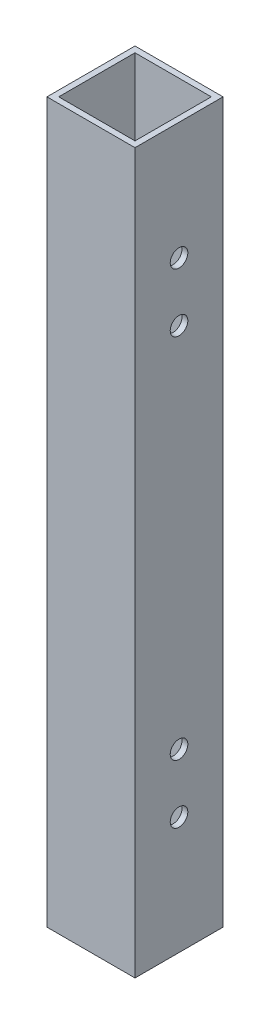
ISO-10303-21;
HEADER;
FILE_DESCRIPTION(('STEP AP214'),'2;1');
FILE_NAME('part.step','',(''),(''),'','','');
FILE_SCHEMA(('AUTOMOTIVE_DESIGN { 1 0 10303 214 1 1 1 1 }'));
ENDSEC;
DATA;
#1=APPLICATION_CONTEXT('core data for automotive mechanical design processes');
#2=APPLICATION_PROTOCOL_DEFINITION('international standard','automotive_design',2000,#1);
#3=PRODUCT_CONTEXT('',#1,'mechanical');
#4=PRODUCT('Part','Part','',(#3));
#5=PRODUCT_RELATED_PRODUCT_CATEGORY('part','',(#4));
#6=PRODUCT_DEFINITION_FORMATION('','',#4);
#7=PRODUCT_DEFINITION_CONTEXT('part definition',#1,'design');
#8=PRODUCT_DEFINITION('design','',#6,#7);
#9=PRODUCT_DEFINITION_SHAPE('','',#8);
#10=(LENGTH_UNIT() NAMED_UNIT(*) SI_UNIT(.MILLI.,.METRE.));
#11=(NAMED_UNIT(*) PLANE_ANGLE_UNIT() SI_UNIT($,.RADIAN.));
#12=(NAMED_UNIT(*) SI_UNIT($,.STERADIAN.) SOLID_ANGLE_UNIT());
#13=UNCERTAINTY_MEASURE_WITH_UNIT(LENGTH_MEASURE(1.E-05),#10,'distance_accuracy_value','');
#14=(GEOMETRIC_REPRESENTATION_CONTEXT(3) GLOBAL_UNCERTAINTY_ASSIGNED_CONTEXT((#13)) GLOBAL_UNIT_ASSIGNED_CONTEXT((#10,
#11,#12)) REPRESENTATION_CONTEXT('',''));
#15=CARTESIAN_POINT('',(0.,0.,0.));
#16=DIRECTION('',(0.,0.,1.));
#17=DIRECTION('',(1.,0.,0.));
#18=AXIS2_PLACEMENT_3D('',#15,#16,#17);
#19=CARTESIAN_POINT('',(15.,245.,15.));
#20=DIRECTION('',(0.,0.,-1.));
#21=DIRECTION('',(-1.,0.,0.));
#22=AXIS2_PLACEMENT_3D('',#19,#20,#21);
#23=PLANE('',#22);
#24=DIRECTION('',(1.,0.,0.));
#25=VECTOR('',#24,1.);
#26=CARTESIAN_POINT('',(15.,0.,15.));
#27=LINE('',#26,#25);
#28=CARTESIAN_POINT('',(-15.,0.,15.));
#29=VERTEX_POINT('',#28);
#30=CARTESIAN_POINT('',(15.,0.,15.));
#31=VERTEX_POINT('',#30);
#32=EDGE_CURVE('E134',#29,#31,#27,.T.);
#33=ORIENTED_EDGE('',*,*,#32,.T.);
#34=DIRECTION('',(0.,-1.,0.));
#35=VECTOR('',#34,1.);
#36=CARTESIAN_POINT('',(15.,245.,15.));
#37=LINE('',#36,#35);
#38=CARTESIAN_POINT('',(15.,245.,15.));
#39=VERTEX_POINT('',#38);
#40=EDGE_CURVE('E40',#39,#31,#37,.T.);
#41=ORIENTED_EDGE('',*,*,#40,.F.);
#42=DIRECTION('',(1.,0.,0.));
#43=VECTOR('',#42,1.);
#44=CARTESIAN_POINT('',(15.,245.,15.));
#45=LINE('',#44,#43);
#46=CARTESIAN_POINT('',(-15.,245.,15.));
#47=VERTEX_POINT('',#46);
#48=EDGE_CURVE('E141',#47,#39,#45,.T.);
#49=ORIENTED_EDGE('',*,*,#48,.F.);
#50=DIRECTION('',(0.,-1.,0.));
#51=VECTOR('',#50,1.);
#52=CARTESIAN_POINT('',(-15.,245.,15.));
#53=LINE('',#52,#51);
#54=EDGE_CURVE('E11',#47,#29,#53,.T.);
#55=ORIENTED_EDGE('',*,*,#54,.T.);
#56=EDGE_LOOP('',(#33,#41,#49,#55));
#57=FACE_BOUND('',#56,.T.);
#58=ADVANCED_FACE('F32',(#57),#23,.F.);
#59=CARTESIAN_POINT('',(15.,245.,-15.));
#60=DIRECTION('',(-1.,0.,0.));
#61=DIRECTION('',(0.,0.,1.));
#62=AXIS2_PLACEMENT_3D('',#59,#60,#61);
#63=PLANE('',#62);
#64=CARTESIAN_POINT('',(15.,40.,0.));
#65=DIRECTION('',(-1.,0.,0.));
#66=DIRECTION('',(0.,0.,1.));
#67=AXIS2_PLACEMENT_3D('',#64,#65,#66);
#68=CIRCLE('',#67,3.);
#69=CARTESIAN_POINT('',(15.,40.,3.));
#70=VERTEX_POINT('',#69);
#71=EDGE_CURVE('E277',#70,#70,#68,.T.);
#72=ORIENTED_EDGE('',*,*,#71,.T.);
#73=EDGE_LOOP('',(#72));
#74=FACE_BOUND('',#73,.T.);
#75=CARTESIAN_POINT('',(15.,60.,0.));
#76=DIRECTION('',(-1.,0.,0.));
#77=DIRECTION('',(0.,0.,1.));
#78=AXIS2_PLACEMENT_3D('',#75,#76,#77);
#79=CIRCLE('',#78,3.);
#80=CARTESIAN_POINT('',(15.,60.,3.));
#81=VERTEX_POINT('',#80);
#82=EDGE_CURVE('E174',#81,#81,#79,.T.);
#83=ORIENTED_EDGE('',*,*,#82,.T.);
#84=EDGE_LOOP('',(#83));
#85=FACE_BOUND('',#84,.T.);
#86=CARTESIAN_POINT('',(15.,185.,0.));
#87=DIRECTION('',(-1.,0.,0.));
#88=DIRECTION('',(0.,0.,1.));
#89=AXIS2_PLACEMENT_3D('',#86,#87,#88);
#90=CIRCLE('',#89,3.);
#91=CARTESIAN_POINT('',(15.,185.,3.));
#92=VERTEX_POINT('',#91);
#93=EDGE_CURVE('E170',#92,#92,#90,.T.);
#94=ORIENTED_EDGE('',*,*,#93,.T.);
#95=EDGE_LOOP('',(#94));
#96=FACE_BOUND('',#95,.T.);
#97=CARTESIAN_POINT('',(15.,205.,0.));
#98=DIRECTION('',(-1.,0.,0.));
#99=DIRECTION('',(0.,0.,1.));
#100=AXIS2_PLACEMENT_3D('',#97,#98,#99);
#101=CIRCLE('',#100,3.);
#102=CARTESIAN_POINT('',(15.,205.,3.));
#103=VERTEX_POINT('',#102);
#104=EDGE_CURVE('E166',#103,#103,#101,.T.);
#105=ORIENTED_EDGE('',*,*,#104,.T.);
#106=EDGE_LOOP('',(#105));
#107=FACE_BOUND('',#106,.T.);
#108=DIRECTION('',(0.,0.,-1.));
#109=VECTOR('',#108,1.);
#110=CARTESIAN_POINT('',(15.,0.,-15.));
#111=LINE('',#110,#109);
#112=CARTESIAN_POINT('',(15.,0.,-15.));
#113=VERTEX_POINT('',#112);
#114=EDGE_CURVE('E151',#31,#113,#111,.T.);
#115=ORIENTED_EDGE('',*,*,#114,.T.);
#116=DIRECTION('',(0.,-1.,0.));
#117=VECTOR('',#116,1.);
#118=CARTESIAN_POINT('',(15.,245.,-15.));
#119=LINE('',#118,#117);
#120=CARTESIAN_POINT('',(15.,245.,-15.));
#121=VERTEX_POINT('',#120);
#122=EDGE_CURVE('E158',#121,#113,#119,.T.);
#123=ORIENTED_EDGE('',*,*,#122,.F.);
#124=DIRECTION('',(0.,0.,-1.));
#125=VECTOR('',#124,1.);
#126=CARTESIAN_POINT('',(15.,245.,-15.));
#127=LINE('',#126,#125);
#128=EDGE_CURVE('E144',#39,#121,#127,.T.);
#129=ORIENTED_EDGE('',*,*,#128,.F.);
#130=ORIENTED_EDGE('',*,*,#40,.T.);
#131=EDGE_LOOP('',(#115,#123,#129,#130));
#132=FACE_BOUND('',#131,.T.);
#133=ADVANCED_FACE('F226',(#74,#85,#96,#107,#132),#63,.F.);
#134=CARTESIAN_POINT('',(-15.,245.,-15.));
#135=DIRECTION('',(0.,0.,1.));
#136=DIRECTION('',(1.,0.,0.));
#137=AXIS2_PLACEMENT_3D('',#134,#135,#136);
#138=PLANE('',#137);
#139=DIRECTION('',(-1.,0.,0.));
#140=VECTOR('',#139,1.);
#141=CARTESIAN_POINT('',(-15.,0.,-15.));
#142=LINE('',#141,#140);
#143=CARTESIAN_POINT('',(-15.,0.,-15.));
#144=VERTEX_POINT('',#143);
#145=EDGE_CURVE('E153',#113,#144,#142,.T.);
#146=ORIENTED_EDGE('',*,*,#145,.T.);
#147=DIRECTION('',(0.,-1.,0.));
#148=VECTOR('',#147,1.);
#149=CARTESIAN_POINT('',(-15.,245.,-15.));
#150=LINE('',#149,#148);
#151=CARTESIAN_POINT('',(-15.,245.,-15.));
#152=VERTEX_POINT('',#151);
#153=EDGE_CURVE('E149',#152,#144,#150,.T.);
#154=ORIENTED_EDGE('',*,*,#153,.F.);
#155=DIRECTION('',(-1.,0.,0.));
#156=VECTOR('',#155,1.);
#157=CARTESIAN_POINT('',(-15.,245.,-15.));
#158=LINE('',#157,#156);
#159=EDGE_CURVE('E146',#121,#152,#158,.T.);
#160=ORIENTED_EDGE('',*,*,#159,.F.);
#161=ORIENTED_EDGE('',*,*,#122,.T.);
#162=EDGE_LOOP('',(#146,#154,#160,#161));
#163=FACE_BOUND('',#162,.T.);
#164=ADVANCED_FACE('F209',(#163),#138,.F.);
#165=CARTESIAN_POINT('',(-15.,245.,0.));
#166=DIRECTION('',(1.,0.,0.));
#167=DIRECTION('',(0.,0.,-1.));
#168=AXIS2_PLACEMENT_3D('',#165,#166,#167);
#169=PLANE('',#168);
#170=CARTESIAN_POINT('',(-15.,40.,0.));
#171=DIRECTION('',(-1.,0.,0.));
#172=DIRECTION('',(0.,0.,1.));
#173=AXIS2_PLACEMENT_3D('',#170,#171,#172);
#174=CIRCLE('',#173,3.);
#175=CARTESIAN_POINT('',(-15.,40.,3.));
#176=VERTEX_POINT('',#175);
#177=EDGE_CURVE('E282',#176,#176,#174,.T.);
#178=ORIENTED_EDGE('',*,*,#177,.F.);
#179=EDGE_LOOP('',(#178));
#180=FACE_BOUND('',#179,.T.);
#181=CARTESIAN_POINT('',(-15.,60.,0.));
#182=DIRECTION('',(-1.,0.,0.));
#183=DIRECTION('',(0.,0.,1.));
#184=AXIS2_PLACEMENT_3D('',#181,#182,#183);
#185=CIRCLE('',#184,3.);
#186=CARTESIAN_POINT('',(-15.,60.,3.));
#187=VERTEX_POINT('',#186);
#188=EDGE_CURVE('E181',#187,#187,#185,.T.);
#189=ORIENTED_EDGE('',*,*,#188,.F.);
#190=EDGE_LOOP('',(#189));
#191=FACE_BOUND('',#190,.T.);
#192=CARTESIAN_POINT('',(-15.,185.,0.));
#193=DIRECTION('',(-1.,0.,0.));
#194=DIRECTION('',(0.,0.,1.));
#195=AXIS2_PLACEMENT_3D('',#192,#193,#194);
#196=CIRCLE('',#195,3.);
#197=CARTESIAN_POINT('',(-15.,185.,3.));
#198=VERTEX_POINT('',#197);
#199=EDGE_CURVE('E178',#198,#198,#196,.T.);
#200=ORIENTED_EDGE('',*,*,#199,.F.);
#201=EDGE_LOOP('',(#200));
#202=FACE_BOUND('',#201,.T.);
#203=CARTESIAN_POINT('',(-15.,205.,0.));
#204=DIRECTION('',(-1.,0.,0.));
#205=DIRECTION('',(0.,0.,1.));
#206=AXIS2_PLACEMENT_3D('',#203,#204,#205);
#207=CIRCLE('',#206,3.);
#208=CARTESIAN_POINT('',(-15.,205.,3.));
#209=VERTEX_POINT('',#208);
#210=EDGE_CURVE('E197',#209,#209,#207,.T.);
#211=ORIENTED_EDGE('',*,*,#210,.F.);
#212=EDGE_LOOP('',(#211));
#213=FACE_BOUND('',#212,.T.);
#214=DIRECTION('',(0.,0.,1.));
#215=VECTOR('',#214,1.);
#216=CARTESIAN_POINT('',(-15.,0.,0.));
#217=LINE('',#216,#215);
#218=EDGE_CURVE('E142',#144,#29,#217,.T.);
#219=ORIENTED_EDGE('',*,*,#218,.T.);
#220=ORIENTED_EDGE('',*,*,#54,.F.);
#221=DIRECTION('',(0.,0.,1.));
#222=VECTOR('',#221,1.);
#223=CARTESIAN_POINT('',(-15.,245.,15.));
#224=LINE('',#223,#222);
#225=EDGE_CURVE('E138',#152,#47,#224,.T.);
#226=ORIENTED_EDGE('',*,*,#225,.F.);
#227=ORIENTED_EDGE('',*,*,#153,.T.);
#228=EDGE_LOOP('',(#219,#220,#226,#227));
#229=FACE_BOUND('',#228,.T.);
#230=ADVANCED_FACE('F205',(#180,#191,#202,#213,#229),#169,.F.);
#231=CARTESIAN_POINT('',(0.,245.,0.));
#232=DIRECTION('',(0.,-1.,0.));
#233=DIRECTION('',(0.,0.,-1.));
#234=AXIS2_PLACEMENT_3D('',#231,#232,#233);
#235=PLANE('',#234);
#236=DIRECTION('',(0.,0.,1.));
#237=VECTOR('',#236,1.);
#238=CARTESIAN_POINT('',(-13.,245.,-13.));
#239=LINE('',#238,#237);
#240=CARTESIAN_POINT('',(-13.,245.,-13.));
#241=VERTEX_POINT('',#240);
#242=CARTESIAN_POINT('',(-13.,245.,13.));
#243=VERTEX_POINT('',#242);
#244=EDGE_CURVE('E128',#241,#243,#239,.T.);
#245=ORIENTED_EDGE('',*,*,#244,.F.);
#246=DIRECTION('',(-1.,0.,0.));
#247=VECTOR('',#246,1.);
#248=CARTESIAN_POINT('',(13.,245.,-13.));
#249=LINE('',#248,#247);
#250=CARTESIAN_POINT('',(13.,245.,-13.));
#251=VERTEX_POINT('',#250);
#252=EDGE_CURVE('E48',#251,#241,#249,.T.);
#253=ORIENTED_EDGE('',*,*,#252,.F.);
#254=DIRECTION('',(0.,0.,-1.));
#255=VECTOR('',#254,1.);
#256=CARTESIAN_POINT('',(13.,245.,13.));
#257=LINE('',#256,#255);
#258=CARTESIAN_POINT('',(13.,245.,13.));
#259=VERTEX_POINT('',#258);
#260=EDGE_CURVE('E116',#259,#251,#257,.T.);
#261=ORIENTED_EDGE('',*,*,#260,.F.);
#262=DIRECTION('',(1.,0.,0.));
#263=VECTOR('',#262,1.);
#264=CARTESIAN_POINT('',(-13.,245.,13.));
#265=LINE('',#264,#263);
#266=EDGE_CURVE('E119',#243,#259,#265,.T.);
#267=ORIENTED_EDGE('',*,*,#266,.F.);
#268=EDGE_LOOP('',(#245,#253,#261,#267));
#269=FACE_BOUND('',#268,.T.);
#270=ORIENTED_EDGE('',*,*,#225,.T.);
#271=ORIENTED_EDGE('',*,*,#48,.T.);
#272=ORIENTED_EDGE('',*,*,#128,.T.);
#273=ORIENTED_EDGE('',*,*,#159,.T.);
#274=EDGE_LOOP('',(#270,#271,#272,#273));
#275=FACE_BOUND('',#274,.T.);
#276=ADVANCED_FACE('F208',(#269,#275),#235,.F.);
#277=CARTESIAN_POINT('',(0.,0.,0.));
#278=DIRECTION('',(0.,-1.,0.));
#279=DIRECTION('',(0.,0.,-1.));
#280=AXIS2_PLACEMENT_3D('',#277,#278,#279);
#281=PLANE('',#280);
#282=DIRECTION('',(-1.,0.,0.));
#283=VECTOR('',#282,1.);
#284=CARTESIAN_POINT('',(13.,0.,-13.));
#285=LINE('',#284,#283);
#286=CARTESIAN_POINT('',(13.,0.,-13.));
#287=VERTEX_POINT('',#286);
#288=CARTESIAN_POINT('',(-13.,0.,-13.));
#289=VERTEX_POINT('',#288);
#290=EDGE_CURVE('E100',#287,#289,#285,.T.);
#291=ORIENTED_EDGE('',*,*,#290,.T.);
#292=DIRECTION('',(0.,0.,1.));
#293=VECTOR('',#292,1.);
#294=CARTESIAN_POINT('',(-13.,0.,-13.));
#295=LINE('',#294,#293);
#296=CARTESIAN_POINT('',(-13.,0.,13.));
#297=VERTEX_POINT('',#296);
#298=EDGE_CURVE('E109',#289,#297,#295,.T.);
#299=ORIENTED_EDGE('',*,*,#298,.T.);
#300=DIRECTION('',(1.,0.,0.));
#301=VECTOR('',#300,1.);
#302=CARTESIAN_POINT('',(-13.,0.,13.));
#303=LINE('',#302,#301);
#304=CARTESIAN_POINT('',(13.,0.,13.));
#305=VERTEX_POINT('',#304);
#306=EDGE_CURVE('E56',#297,#305,#303,.T.);
#307=ORIENTED_EDGE('',*,*,#306,.T.);
#308=DIRECTION('',(0.,0.,-1.));
#309=VECTOR('',#308,1.);
#310=CARTESIAN_POINT('',(13.,0.,13.));
#311=LINE('',#310,#309);
#312=EDGE_CURVE('E106',#305,#287,#311,.T.);
#313=ORIENTED_EDGE('',*,*,#312,.T.);
#314=EDGE_LOOP('',(#291,#299,#307,#313));
#315=FACE_BOUND('',#314,.T.);
#316=ORIENTED_EDGE('',*,*,#32,.F.);
#317=ORIENTED_EDGE('',*,*,#218,.F.);
#318=ORIENTED_EDGE('',*,*,#145,.F.);
#319=ORIENTED_EDGE('',*,*,#114,.F.);
#320=EDGE_LOOP('',(#316,#317,#318,#319));
#321=FACE_BOUND('',#320,.T.);
#322=ADVANCED_FACE('F113',(#315,#321),#281,.T.);
#323=CARTESIAN_POINT('',(13.,0.,-13.));
#324=DIRECTION('',(0.,0.,-1.));
#325=DIRECTION('',(-1.,0.,0.));
#326=AXIS2_PLACEMENT_3D('',#323,#324,#325);
#327=PLANE('',#326);
#328=ORIENTED_EDGE('',*,*,#252,.T.);
#329=DIRECTION('',(0.,1.,0.));
#330=VECTOR('',#329,1.);
#331=CARTESIAN_POINT('',(-13.,0.,-13.));
#332=LINE('',#331,#330);
#333=EDGE_CURVE('E96',#289,#241,#332,.T.);
#334=ORIENTED_EDGE('',*,*,#333,.F.);
#335=ORIENTED_EDGE('',*,*,#290,.F.);
#336=DIRECTION('',(0.,1.,0.));
#337=VECTOR('',#336,1.);
#338=CARTESIAN_POINT('',(13.,0.,-13.));
#339=LINE('',#338,#337);
#340=EDGE_CURVE('E132',#287,#251,#339,.T.);
#341=ORIENTED_EDGE('',*,*,#340,.T.);
#342=EDGE_LOOP('',(#328,#334,#335,#341));
#343=FACE_BOUND('',#342,.T.);
#344=ADVANCED_FACE('F98',(#343),#327,.F.);
#345=CARTESIAN_POINT('',(13.,0.,13.));
#346=DIRECTION('',(1.,0.,0.));
#347=DIRECTION('',(0.,0.,-1.));
#348=AXIS2_PLACEMENT_3D('',#345,#346,#347);
#349=PLANE('',#348);
#350=CARTESIAN_POINT('',(13.,40.,0.));
#351=DIRECTION('',(1.,0.,0.));
#352=DIRECTION('',(0.,0.,-1.));
#353=AXIS2_PLACEMENT_3D('',#350,#351,#352);
#354=CIRCLE('',#353,3.);
#355=CARTESIAN_POINT('',(13.,40.,-3.));
#356=VERTEX_POINT('',#355);
#357=EDGE_CURVE('E186',#356,#356,#354,.T.);
#358=ORIENTED_EDGE('',*,*,#357,.T.);
#359=EDGE_LOOP('',(#358));
#360=FACE_BOUND('',#359,.T.);
#361=CARTESIAN_POINT('',(13.,60.,0.));
#362=DIRECTION('',(1.,0.,0.));
#363=DIRECTION('',(0.,0.,-1.));
#364=AXIS2_PLACEMENT_3D('',#361,#362,#363);
#365=CIRCLE('',#364,3.);
#366=CARTESIAN_POINT('',(13.,60.,-3.));
#367=VERTEX_POINT('',#366);
#368=EDGE_CURVE('E173',#367,#367,#365,.T.);
#369=ORIENTED_EDGE('',*,*,#368,.T.);
#370=EDGE_LOOP('',(#369));
#371=FACE_BOUND('',#370,.T.);
#372=CARTESIAN_POINT('',(13.,185.,0.));
#373=DIRECTION('',(1.,0.,0.));
#374=DIRECTION('',(0.,0.,-1.));
#375=AXIS2_PLACEMENT_3D('',#372,#373,#374);
#376=CIRCLE('',#375,3.);
#377=CARTESIAN_POINT('',(13.,185.,-3.));
#378=VERTEX_POINT('',#377);
#379=EDGE_CURVE('E169',#378,#378,#376,.T.);
#380=ORIENTED_EDGE('',*,*,#379,.T.);
#381=EDGE_LOOP('',(#380));
#382=FACE_BOUND('',#381,.T.);
#383=CARTESIAN_POINT('',(13.,205.,0.));
#384=DIRECTION('',(1.,0.,0.));
#385=DIRECTION('',(0.,0.,-1.));
#386=AXIS2_PLACEMENT_3D('',#383,#384,#385);
#387=CIRCLE('',#386,3.);
#388=CARTESIAN_POINT('',(13.,205.,-3.));
#389=VERTEX_POINT('',#388);
#390=EDGE_CURVE('E122',#389,#389,#387,.T.);
#391=ORIENTED_EDGE('',*,*,#390,.T.);
#392=EDGE_LOOP('',(#391));
#393=FACE_BOUND('',#392,.T.);
#394=ORIENTED_EDGE('',*,*,#260,.T.);
#395=ORIENTED_EDGE('',*,*,#340,.F.);
#396=ORIENTED_EDGE('',*,*,#312,.F.);
#397=DIRECTION('',(0.,1.,0.));
#398=VECTOR('',#397,1.);
#399=CARTESIAN_POINT('',(13.,0.,13.));
#400=LINE('',#399,#398);
#401=EDGE_CURVE('E135',#305,#259,#400,.T.);
#402=ORIENTED_EDGE('',*,*,#401,.T.);
#403=EDGE_LOOP('',(#394,#395,#396,#402));
#404=FACE_BOUND('',#403,.T.);
#405=ADVANCED_FACE('F243',(#360,#371,#382,#393,#404),#349,.F.);
#406=CARTESIAN_POINT('',(-13.,0.,13.));
#407=DIRECTION('',(0.,0.,1.));
#408=DIRECTION('',(1.,0.,0.));
#409=AXIS2_PLACEMENT_3D('',#406,#407,#408);
#410=PLANE('',#409);
#411=ORIENTED_EDGE('',*,*,#266,.T.);
#412=ORIENTED_EDGE('',*,*,#401,.F.);
#413=ORIENTED_EDGE('',*,*,#306,.F.);
#414=DIRECTION('',(0.,1.,0.));
#415=VECTOR('',#414,1.);
#416=CARTESIAN_POINT('',(-13.,0.,13.));
#417=LINE('',#416,#415);
#418=EDGE_CURVE('E105',#297,#243,#417,.T.);
#419=ORIENTED_EDGE('',*,*,#418,.T.);
#420=EDGE_LOOP('',(#411,#412,#413,#419));
#421=FACE_BOUND('',#420,.T.);
#422=ADVANCED_FACE('F246',(#421),#410,.F.);
#423=CARTESIAN_POINT('',(-13.,0.,-13.));
#424=DIRECTION('',(-1.,0.,0.));
#425=DIRECTION('',(0.,0.,1.));
#426=AXIS2_PLACEMENT_3D('',#423,#424,#425);
#427=PLANE('',#426);
#428=CARTESIAN_POINT('',(-13.,40.,0.));
#429=DIRECTION('',(-1.,0.,0.));
#430=DIRECTION('',(0.,0.,1.));
#431=AXIS2_PLACEMENT_3D('',#428,#429,#430);
#432=CIRCLE('',#431,3.);
#433=CARTESIAN_POINT('',(-13.,40.,3.));
#434=VERTEX_POINT('',#433);
#435=EDGE_CURVE('E35',#434,#434,#432,.T.);
#436=ORIENTED_EDGE('',*,*,#435,.T.);
#437=EDGE_LOOP('',(#436));
#438=FACE_BOUND('',#437,.T.);
#439=CARTESIAN_POINT('',(-13.,60.,0.));
#440=DIRECTION('',(-1.,0.,0.));
#441=DIRECTION('',(0.,0.,1.));
#442=AXIS2_PLACEMENT_3D('',#439,#440,#441);
#443=CIRCLE('',#442,3.);
#444=CARTESIAN_POINT('',(-13.,60.,3.));
#445=VERTEX_POINT('',#444);
#446=EDGE_CURVE('E171',#445,#445,#443,.T.);
#447=ORIENTED_EDGE('',*,*,#446,.T.);
#448=EDGE_LOOP('',(#447));
#449=FACE_BOUND('',#448,.T.);
#450=CARTESIAN_POINT('',(-13.,185.,0.));
#451=DIRECTION('',(-1.,0.,0.));
#452=DIRECTION('',(0.,0.,1.));
#453=AXIS2_PLACEMENT_3D('',#450,#451,#452);
#454=CIRCLE('',#453,3.);
#455=CARTESIAN_POINT('',(-13.,185.,3.));
#456=VERTEX_POINT('',#455);
#457=EDGE_CURVE('E167',#456,#456,#454,.T.);
#458=ORIENTED_EDGE('',*,*,#457,.T.);
#459=EDGE_LOOP('',(#458));
#460=FACE_BOUND('',#459,.T.);
#461=CARTESIAN_POINT('',(-13.,205.,0.));
#462=DIRECTION('',(-1.,0.,0.));
#463=DIRECTION('',(0.,0.,1.));
#464=AXIS2_PLACEMENT_3D('',#461,#462,#463);
#465=CIRCLE('',#464,3.);
#466=CARTESIAN_POINT('',(-13.,205.,3.));
#467=VERTEX_POINT('',#466);
#468=EDGE_CURVE('E163',#467,#467,#465,.T.);
#469=ORIENTED_EDGE('',*,*,#468,.T.);
#470=EDGE_LOOP('',(#469));
#471=FACE_BOUND('',#470,.T.);
#472=ORIENTED_EDGE('',*,*,#244,.T.);
#473=ORIENTED_EDGE('',*,*,#418,.F.);
#474=ORIENTED_EDGE('',*,*,#298,.F.);
#475=ORIENTED_EDGE('',*,*,#333,.T.);
#476=EDGE_LOOP('',(#472,#473,#474,#475));
#477=FACE_BOUND('',#476,.T.);
#478=ADVANCED_FACE('F110',(#438,#449,#460,#471,#477),#427,.F.);
#479=CARTESIAN_POINT('',(15.,205.,0.));
#480=DIRECTION('',(-1.,0.,0.));
#481=DIRECTION('',(0.,0.,1.));
#482=AXIS2_PLACEMENT_3D('',#479,#480,#481);
#483=CYLINDRICAL_SURFACE('',#482,3.);
#484=ORIENTED_EDGE('',*,*,#210,.T.);
#485=EDGE_LOOP('',(#484));
#486=FACE_BOUND('',#485,.T.);
#487=ORIENTED_EDGE('',*,*,#468,.F.);
#488=EDGE_LOOP('',(#487));
#489=FACE_BOUND('',#488,.T.);
#490=ADVANCED_FACE('F202',(#486,#489),#483,.F.);
#491=ORIENTED_EDGE('',*,*,#104,.F.);
#492=EDGE_LOOP('',(#491));
#493=FACE_BOUND('',#492,.T.);
#494=ORIENTED_EDGE('',*,*,#390,.F.);
#495=EDGE_LOOP('',(#494));
#496=FACE_BOUND('',#495,.T.);
#497=ADVANCED_FACE('F253',(#493,#496),#483,.F.);
#498=CARTESIAN_POINT('',(15.,185.,0.));
#499=DIRECTION('',(-1.,0.,0.));
#500=DIRECTION('',(0.,0.,1.));
#501=AXIS2_PLACEMENT_3D('',#498,#499,#500);
#502=CYLINDRICAL_SURFACE('',#501,3.);
#503=ORIENTED_EDGE('',*,*,#199,.T.);
#504=EDGE_LOOP('',(#503));
#505=FACE_BOUND('',#504,.T.);
#506=ORIENTED_EDGE('',*,*,#457,.F.);
#507=EDGE_LOOP('',(#506));
#508=FACE_BOUND('',#507,.T.);
#509=ADVANCED_FACE('F256',(#505,#508),#502,.F.);
#510=ORIENTED_EDGE('',*,*,#93,.F.);
#511=EDGE_LOOP('',(#510));
#512=FACE_BOUND('',#511,.T.);
#513=ORIENTED_EDGE('',*,*,#379,.F.);
#514=EDGE_LOOP('',(#513));
#515=FACE_BOUND('',#514,.T.);
#516=ADVANCED_FACE('F258',(#512,#515),#502,.F.);
#517=CARTESIAN_POINT('',(15.,60.,0.));
#518=DIRECTION('',(-1.,0.,0.));
#519=DIRECTION('',(0.,0.,1.));
#520=AXIS2_PLACEMENT_3D('',#517,#518,#519);
#521=CYLINDRICAL_SURFACE('',#520,3.);
#522=ORIENTED_EDGE('',*,*,#188,.T.);
#523=EDGE_LOOP('',(#522));
#524=FACE_BOUND('',#523,.T.);
#525=ORIENTED_EDGE('',*,*,#446,.F.);
#526=EDGE_LOOP('',(#525));
#527=FACE_BOUND('',#526,.T.);
#528=ADVANCED_FACE('F261',(#524,#527),#521,.F.);
#529=ORIENTED_EDGE('',*,*,#82,.F.);
#530=EDGE_LOOP('',(#529));
#531=FACE_BOUND('',#530,.T.);
#532=ORIENTED_EDGE('',*,*,#368,.F.);
#533=EDGE_LOOP('',(#532));
#534=FACE_BOUND('',#533,.T.);
#535=ADVANCED_FACE('F263',(#531,#534),#521,.F.);
#536=CARTESIAN_POINT('',(15.,40.,0.));
#537=DIRECTION('',(-1.,0.,0.));
#538=DIRECTION('',(0.,0.,1.));
#539=AXIS2_PLACEMENT_3D('',#536,#537,#538);
#540=CYLINDRICAL_SURFACE('',#539,3.);
#541=ORIENTED_EDGE('',*,*,#177,.T.);
#542=EDGE_LOOP('',(#541));
#543=FACE_BOUND('',#542,.T.);
#544=ORIENTED_EDGE('',*,*,#435,.F.);
#545=EDGE_LOOP('',(#544));
#546=FACE_BOUND('',#545,.T.);
#547=ADVANCED_FACE('F266',(#543,#546),#540,.F.);
#548=ORIENTED_EDGE('',*,*,#71,.F.);
#549=EDGE_LOOP('',(#548));
#550=FACE_BOUND('',#549,.T.);
#551=ORIENTED_EDGE('',*,*,#357,.F.);
#552=EDGE_LOOP('',(#551));
#553=FACE_BOUND('',#552,.T.);
#554=ADVANCED_FACE('F268',(#550,#553),#540,.F.);
#555=CLOSED_SHELL('',(#58,#133,#164,#230,#276,#322,#344,#405,#422,#478,#490,#497,#509,#516,#528,
#535,#547,#554));
#556=MANIFOLD_SOLID_BREP('B2',#555);
#557=ADVANCED_BREP_SHAPE_REPRESENTATION('',(#18,#556),#14);
#558=SHAPE_DEFINITION_REPRESENTATION(#9,#557);
ENDSEC;
END-ISO-10303-21;
